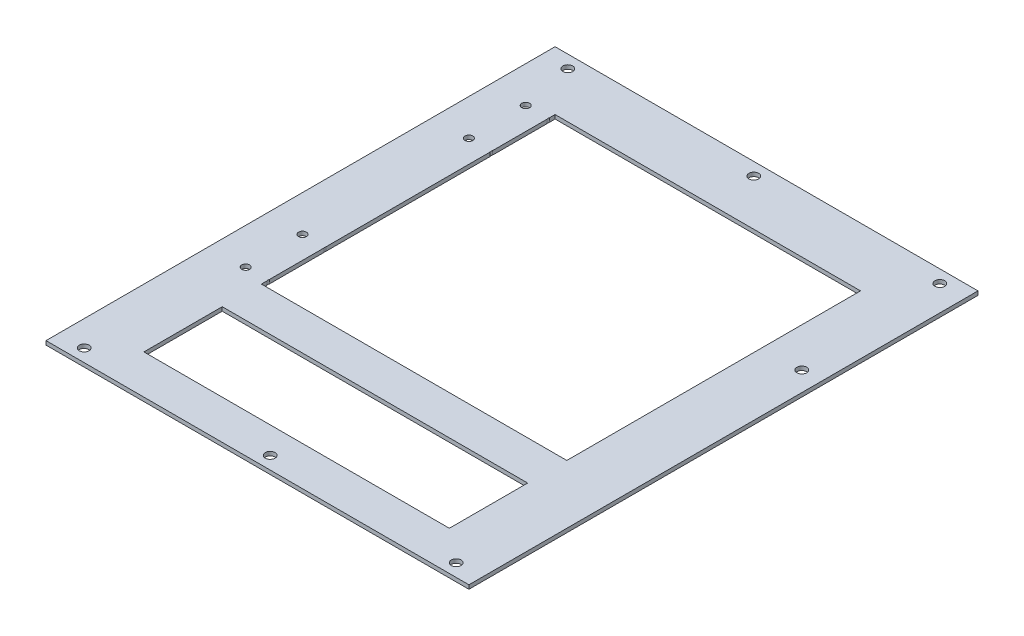
ISO-10303-21;
HEADER;
FILE_DESCRIPTION(('STEP AP214'),'2;1');
FILE_NAME('part.step','',(''),(''),'','','');
FILE_SCHEMA(('AUTOMOTIVE_DESIGN { 1 0 10303 214 1 1 1 1 }'));
ENDSEC;
DATA;
#1=APPLICATION_CONTEXT('core data for automotive mechanical design processes');
#2=APPLICATION_PROTOCOL_DEFINITION('international standard','automotive_design',2000,#1);
#3=PRODUCT_CONTEXT('',#1,'mechanical');
#4=PRODUCT('Part','Part','',(#3));
#5=PRODUCT_RELATED_PRODUCT_CATEGORY('part','',(#4));
#6=PRODUCT_DEFINITION_FORMATION('','',#4);
#7=PRODUCT_DEFINITION_CONTEXT('part definition',#1,'design');
#8=PRODUCT_DEFINITION('design','',#6,#7);
#9=PRODUCT_DEFINITION_SHAPE('','',#8);
#10=(LENGTH_UNIT() NAMED_UNIT(*) SI_UNIT(.MILLI.,.METRE.));
#11=(NAMED_UNIT(*) PLANE_ANGLE_UNIT() SI_UNIT($,.RADIAN.));
#12=(NAMED_UNIT(*) SI_UNIT($,.STERADIAN.) SOLID_ANGLE_UNIT());
#13=UNCERTAINTY_MEASURE_WITH_UNIT(LENGTH_MEASURE(1.E-05),#10,'distance_accuracy_value','');
#14=(GEOMETRIC_REPRESENTATION_CONTEXT(3) GLOBAL_UNCERTAINTY_ASSIGNED_CONTEXT((#13)) GLOBAL_UNIT_ASSIGNED_CONTEXT((#10,
#11,#12)) REPRESENTATION_CONTEXT('',''));
#15=CARTESIAN_POINT('',(0.,0.,0.));
#16=DIRECTION('',(0.,0.,1.));
#17=DIRECTION('',(1.,0.,0.));
#18=AXIS2_PLACEMENT_3D('',#15,#16,#17);
#19=CARTESIAN_POINT('',(-78.,2.,50.));
#20=DIRECTION('',(-1.,0.,0.));
#21=DIRECTION('',(0.,0.,1.));
#22=AXIS2_PLACEMENT_3D('',#19,#20,#21);
#23=PLANE('',#22);
#24=DIRECTION('',(0.,0.,-1.));
#25=VECTOR('',#24,1.);
#26=CARTESIAN_POINT('',(-78.,0.,50.));
#27=LINE('',#26,#25);
#28=CARTESIAN_POINT('',(-78.,0.,50.));
#29=VERTEX_POINT('',#28);
#30=CARTESIAN_POINT('',(-78.,0.,47.124498926168));
#31=VERTEX_POINT('',#30);
#32=EDGE_CURVE('E186',#29,#31,#27,.T.);
#33=ORIENTED_EDGE('',*,*,#32,.T.);
#34=DIRECTION('',(0.,1.,0.));
#35=VECTOR('',#34,1.);
#36=CARTESIAN_POINT('',(-78.,3.80000000000001,47.124498926168));
#37=LINE('',#36,#35);
#38=CARTESIAN_POINT('',(-78.,2.,47.124498926168));
#39=VERTEX_POINT('',#38);
#40=EDGE_CURVE('E51',#31,#39,#37,.T.);
#41=ORIENTED_EDGE('',*,*,#40,.T.);
#42=DIRECTION('',(0.,0.,-1.));
#43=VECTOR('',#42,1.);
#44=CARTESIAN_POINT('',(-78.,2.,50.));
#45=LINE('',#44,#43);
#46=CARTESIAN_POINT('',(-78.,2.,50.));
#47=VERTEX_POINT('',#46);
#48=EDGE_CURVE('E375',#47,#39,#45,.T.);
#49=ORIENTED_EDGE('',*,*,#48,.F.);
#50=DIRECTION('',(0.,-1.,0.));
#51=VECTOR('',#50,1.);
#52=CARTESIAN_POINT('',(-78.,2.,50.));
#53=LINE('',#52,#51);
#54=EDGE_CURVE('E205',#47,#29,#53,.T.);
#55=ORIENTED_EDGE('',*,*,#54,.T.);
#56=EDGE_LOOP('',(#33,#41,#49,#55));
#57=FACE_BOUND('',#56,.T.);
#58=ADVANCED_FACE('F34',(#57),#23,.F.);
#59=CARTESIAN_POINT('',(-78.,2.,45.8755011017217));
#60=VERTEX_POINT('',#59);
#61=CARTESIAN_POINT('',(-78.,2.,18.124498926168));
#62=VERTEX_POINT('',#61);
#63=EDGE_CURVE('E179',#60,#62,#45,.T.);
#64=ORIENTED_EDGE('',*,*,#63,.F.);
#65=DIRECTION('',(0.,1.,0.));
#66=VECTOR('',#65,1.);
#67=CARTESIAN_POINT('',(-78.,3.80000000000001,45.8755011017217));
#68=LINE('',#67,#66);
#69=CARTESIAN_POINT('',(-78.,0.,45.8755011017217));
#70=VERTEX_POINT('',#69);
#71=EDGE_CURVE('E172',#60,#70,#68,.F.);
#72=ORIENTED_EDGE('',*,*,#71,.T.);
#73=CARTESIAN_POINT('',(-78.,0.,18.124498926168));
#74=VERTEX_POINT('',#73);
#75=EDGE_CURVE('E58',#70,#74,#27,.T.);
#76=ORIENTED_EDGE('',*,*,#75,.T.);
#77=DIRECTION('',(0.,1.,0.));
#78=VECTOR('',#77,1.);
#79=CARTESIAN_POINT('',(-78.,3.8,18.124498926168));
#80=LINE('',#79,#78);
#81=EDGE_CURVE('E302',#74,#62,#80,.T.);
#82=ORIENTED_EDGE('',*,*,#81,.T.);
#83=EDGE_LOOP('',(#64,#72,#76,#82));
#84=FACE_BOUND('',#83,.T.);
#85=ADVANCED_FACE('F178',(#84),#23,.F.);
#86=CARTESIAN_POINT('',(-78.,2.,16.8755011017216));
#87=VERTEX_POINT('',#86);
#88=CARTESIAN_POINT('',(-78.,2.,-66.8755002001601));
#89=VERTEX_POINT('',#88);
#90=EDGE_CURVE('E405',#87,#89,#45,.T.);
#91=ORIENTED_EDGE('',*,*,#90,.F.);
#92=DIRECTION('',(0.,1.,0.));
#93=VECTOR('',#92,1.);
#94=CARTESIAN_POINT('',(-78.,3.8,16.8755011017216));
#95=LINE('',#94,#93);
#96=CARTESIAN_POINT('',(-78.,0.,16.8755011017216));
#97=VERTEX_POINT('',#96);
#98=EDGE_CURVE('E299',#87,#97,#95,.F.);
#99=ORIENTED_EDGE('',*,*,#98,.T.);
#100=CARTESIAN_POINT('',(-78.,0.,-66.8755002001601));
#101=VERTEX_POINT('',#100);
#102=EDGE_CURVE('E187',#97,#101,#27,.T.);
#103=ORIENTED_EDGE('',*,*,#102,.T.);
#104=DIRECTION('',(0.,1.,0.));
#105=VECTOR('',#104,1.);
#106=CARTESIAN_POINT('',(-78.,3.79999999999997,-66.8755002001601));
#107=LINE('',#106,#105);
#108=EDGE_CURVE('E315',#101,#89,#107,.T.);
#109=ORIENTED_EDGE('',*,*,#108,.T.);
#110=EDGE_LOOP('',(#91,#99,#103,#109));
#111=FACE_BOUND('',#110,.T.);
#112=ADVANCED_FACE('F414',(#111),#23,.F.);
#113=CARTESIAN_POINT('',(-78.,2.,-68.1244997998396));
#114=VERTEX_POINT('',#113);
#115=CARTESIAN_POINT('',(-78.,2.,-95.87550020016));
#116=VERTEX_POINT('',#115);
#117=EDGE_CURVE('E404',#114,#116,#45,.T.);
#118=ORIENTED_EDGE('',*,*,#117,.F.);
#119=DIRECTION('',(0.,1.,0.));
#120=VECTOR('',#119,1.);
#121=CARTESIAN_POINT('',(-78.,3.79999999999997,-68.1244997998396));
#122=LINE('',#121,#120);
#123=CARTESIAN_POINT('',(-78.,0.,-68.1244997998396));
#124=VERTEX_POINT('',#123);
#125=EDGE_CURVE('E312',#114,#124,#122,.F.);
#126=ORIENTED_EDGE('',*,*,#125,.T.);
#127=CARTESIAN_POINT('',(-78.,0.,-95.87550020016));
#128=VERTEX_POINT('',#127);
#129=EDGE_CURVE('E191',#124,#128,#27,.T.);
#130=ORIENTED_EDGE('',*,*,#129,.T.);
#131=DIRECTION('',(0.,1.,0.));
#132=VECTOR('',#131,1.);
#133=CARTESIAN_POINT('',(-78.,3.79999999999996,-95.87550020016));
#134=LINE('',#133,#132);
#135=EDGE_CURVE('E327',#128,#116,#134,.T.);
#136=ORIENTED_EDGE('',*,*,#135,.T.);
#137=EDGE_LOOP('',(#118,#126,#130,#136));
#138=FACE_BOUND('',#137,.T.);
#139=ADVANCED_FACE('F392',(#138),#23,.F.);
#140=CARTESIAN_POINT('',(-108.,2.,130.));
#141=DIRECTION('',(1.,0.,0.));
#142=DIRECTION('',(0.,0.,-1.));
#143=AXIS2_PLACEMENT_3D('',#140,#141,#142);
#144=PLANE('',#143);
#145=DIRECTION('',(0.,0.,1.));
#146=VECTOR('',#145,1.);
#147=CARTESIAN_POINT('',(-108.,0.,130.));
#148=LINE('',#147,#146);
#149=CARTESIAN_POINT('',(-108.,0.,-130.));
#150=VERTEX_POINT('',#149);
#151=CARTESIAN_POINT('',(-108.,0.,130.));
#152=VERTEX_POINT('',#151);
#153=EDGE_CURVE('E201',#150,#152,#148,.T.);
#154=ORIENTED_EDGE('',*,*,#153,.T.);
#155=DIRECTION('',(0.,-1.,0.));
#156=VECTOR('',#155,1.);
#157=CARTESIAN_POINT('',(-108.,2.,130.));
#158=LINE('',#157,#156);
#159=CARTESIAN_POINT('',(-108.,2.,130.));
#160=VERTEX_POINT('',#159);
#161=EDGE_CURVE('E237',#160,#152,#158,.T.);
#162=ORIENTED_EDGE('',*,*,#161,.F.);
#163=DIRECTION('',(0.,0.,1.));
#164=VECTOR('',#163,1.);
#165=CARTESIAN_POINT('',(-108.,2.,130.));
#166=LINE('',#165,#164);
#167=CARTESIAN_POINT('',(-108.,2.,-130.));
#168=VERTEX_POINT('',#167);
#169=EDGE_CURVE('E211',#168,#160,#166,.T.);
#170=ORIENTED_EDGE('',*,*,#169,.F.);
#171=DIRECTION('',(0.,-1.,0.));
#172=VECTOR('',#171,1.);
#173=CARTESIAN_POINT('',(-108.,2.,-130.));
#174=LINE('',#173,#172);
#175=EDGE_CURVE('E221',#168,#150,#174,.T.);
#176=ORIENTED_EDGE('',*,*,#175,.T.);
#177=EDGE_LOOP('',(#154,#162,#170,#176));
#178=FACE_BOUND('',#177,.T.);
#179=ADVANCED_FACE('F36',(#178),#144,.F.);
#180=CARTESIAN_POINT('',(108.,2.,130.));
#181=DIRECTION('',(0.,0.,-1.));
#182=DIRECTION('',(-1.,0.,0.));
#183=AXIS2_PLACEMENT_3D('',#180,#181,#182);
#184=PLANE('',#183);
#185=DIRECTION('',(1.,0.,0.));
#186=VECTOR('',#185,1.);
#187=CARTESIAN_POINT('',(108.,0.,130.));
#188=LINE('',#187,#186);
#189=CARTESIAN_POINT('',(108.,0.,130.));
#190=VERTEX_POINT('',#189);
#191=EDGE_CURVE('E224',#152,#190,#188,.T.);
#192=ORIENTED_EDGE('',*,*,#191,.T.);
#193=DIRECTION('',(0.,-1.,0.));
#194=VECTOR('',#193,1.);
#195=CARTESIAN_POINT('',(108.,2.,130.));
#196=LINE('',#195,#194);
#197=CARTESIAN_POINT('',(108.,2.,130.));
#198=VERTEX_POINT('',#197);
#199=EDGE_CURVE('E234',#198,#190,#196,.T.);
#200=ORIENTED_EDGE('',*,*,#199,.F.);
#201=DIRECTION('',(1.,0.,0.));
#202=VECTOR('',#201,1.);
#203=CARTESIAN_POINT('',(108.,2.,130.));
#204=LINE('',#203,#202);
#205=EDGE_CURVE('E214',#160,#198,#204,.T.);
#206=ORIENTED_EDGE('',*,*,#205,.F.);
#207=ORIENTED_EDGE('',*,*,#161,.T.);
#208=EDGE_LOOP('',(#192,#200,#206,#207));
#209=FACE_BOUND('',#208,.T.);
#210=ADVANCED_FACE('F453',(#209),#184,.F.);
#211=CARTESIAN_POINT('',(108.,2.,130.));
#212=DIRECTION('',(-1.,0.,0.));
#213=DIRECTION('',(0.,0.,1.));
#214=AXIS2_PLACEMENT_3D('',#211,#212,#213);
#215=PLANE('',#214);
#216=DIRECTION('',(0.,0.,-1.));
#217=VECTOR('',#216,1.);
#218=CARTESIAN_POINT('',(108.,0.,130.));
#219=LINE('',#218,#217);
#220=CARTESIAN_POINT('',(108.,0.,-130.));
#221=VERTEX_POINT('',#220);
#222=EDGE_CURVE('E226',#190,#221,#219,.T.);
#223=ORIENTED_EDGE('',*,*,#222,.T.);
#224=DIRECTION('',(0.,-1.,0.));
#225=VECTOR('',#224,1.);
#226=CARTESIAN_POINT('',(108.,2.,-130.));
#227=LINE('',#226,#225);
#228=CARTESIAN_POINT('',(108.,2.,-130.));
#229=VERTEX_POINT('',#228);
#230=EDGE_CURVE('E231',#229,#221,#227,.T.);
#231=ORIENTED_EDGE('',*,*,#230,.F.);
#232=DIRECTION('',(0.,0.,-1.));
#233=VECTOR('',#232,1.);
#234=CARTESIAN_POINT('',(108.,2.,130.));
#235=LINE('',#234,#233);
#236=EDGE_CURVE('E217',#198,#229,#235,.T.);
#237=ORIENTED_EDGE('',*,*,#236,.F.);
#238=ORIENTED_EDGE('',*,*,#199,.T.);
#239=EDGE_LOOP('',(#223,#231,#237,#238));
#240=FACE_BOUND('',#239,.T.);
#241=ADVANCED_FACE('F657',(#240),#215,.F.);
#242=CARTESIAN_POINT('',(108.,2.,-130.));
#243=DIRECTION('',(0.,0.,1.));
#244=DIRECTION('',(1.,0.,0.));
#245=AXIS2_PLACEMENT_3D('',#242,#243,#244);
#246=PLANE('',#245);
#247=DIRECTION('',(-1.,0.,0.));
#248=VECTOR('',#247,1.);
#249=CARTESIAN_POINT('',(108.,0.,-130.));
#250=LINE('',#249,#248);
#251=EDGE_CURVE('E215',#221,#150,#250,.T.);
#252=ORIENTED_EDGE('',*,*,#251,.T.);
#253=ORIENTED_EDGE('',*,*,#175,.F.);
#254=DIRECTION('',(-1.,0.,0.));
#255=VECTOR('',#254,1.);
#256=CARTESIAN_POINT('',(108.,2.,-130.));
#257=LINE('',#256,#255);
#258=EDGE_CURVE('E219',#229,#168,#257,.T.);
#259=ORIENTED_EDGE('',*,*,#258,.F.);
#260=ORIENTED_EDGE('',*,*,#230,.T.);
#261=EDGE_LOOP('',(#252,#253,#259,#260));
#262=FACE_BOUND('',#261,.T.);
#263=ADVANCED_FACE('F605',(#262),#246,.F.);
#264=CARTESIAN_POINT('',(0.,2.,0.));
#265=DIRECTION('',(0.,1.,0.));
#266=DIRECTION('',(0.,0.,1.));
#267=AXIS2_PLACEMENT_3D('',#264,#265,#266);
#268=PLANE('',#267);
#269=CARTESIAN_POINT('',(94.9999999999996,2.,-123.5));
#270=DIRECTION('',(0.,-1.,0.));
#271=DIRECTION('',(0.,0.,-1.));
#272=AXIS2_PLACEMENT_3D('',#269,#270,#271);
#273=CIRCLE('',#272,2.49999999999989);
#274=CARTESIAN_POINT('',(94.9999999999996,2.,-126.));
#275=VERTEX_POINT('',#274);
#276=EDGE_CURVE('E596',#275,#275,#273,.T.);
#277=ORIENTED_EDGE('',*,*,#276,.T.);
#278=EDGE_LOOP('',(#277));
#279=FACE_BOUND('',#278,.T.);
#280=CARTESIAN_POINT('',(-3.40005801291454E-13,2.,-123.5));
#281=DIRECTION('',(0.,-1.,0.));
#282=DIRECTION('',(0.,0.,-1.));
#283=AXIS2_PLACEMENT_3D('',#280,#281,#282);
#284=CIRCLE('',#283,2.49999999999989);
#285=CARTESIAN_POINT('',(-3.40005801291454E-13,2.,-126.));
#286=VERTEX_POINT('',#285);
#287=EDGE_CURVE('E284',#286,#286,#284,.T.);
#288=ORIENTED_EDGE('',*,*,#287,.T.);
#289=EDGE_LOOP('',(#288));
#290=FACE_BOUND('',#289,.T.);
#291=CARTESIAN_POINT('',(-95.0000000000003,2.,-123.499999999999));
#292=DIRECTION('',(0.,-1.,0.));
#293=DIRECTION('',(0.,0.,-1.));
#294=AXIS2_PLACEMENT_3D('',#291,#292,#293);
#295=CIRCLE('',#294,2.49999999999989);
#296=CARTESIAN_POINT('',(-95.0000000000003,2.,-125.999999999999));
#297=VERTEX_POINT('',#296);
#298=EDGE_CURVE('E274',#297,#297,#295,.T.);
#299=ORIENTED_EDGE('',*,*,#298,.T.);
#300=EDGE_LOOP('',(#299));
#301=FACE_BOUND('',#300,.T.);
#302=CARTESIAN_POINT('',(94.9999999999999,2.,123.5));
#303=DIRECTION('',(0.,-1.,0.));
#304=DIRECTION('',(0.,0.,-1.));
#305=AXIS2_PLACEMENT_3D('',#302,#303,#304);
#306=CIRCLE('',#305,2.49999999999989);
#307=CARTESIAN_POINT('',(94.9999999999999,2.,121.));
#308=VERTEX_POINT('',#307);
#309=EDGE_CURVE('E271',#308,#308,#306,.T.);
#310=ORIENTED_EDGE('',*,*,#309,.T.);
#311=EDGE_LOOP('',(#310));
#312=FACE_BOUND('',#311,.T.);
#313=CARTESIAN_POINT('',(0.,2.,123.5));
#314=DIRECTION('',(0.,-1.,0.));
#315=DIRECTION('',(0.,0.,-1.));
#316=AXIS2_PLACEMENT_3D('',#313,#314,#315);
#317=CIRCLE('',#316,2.49999999999989);
#318=CARTESIAN_POINT('',(0.,2.,121.));
#319=VERTEX_POINT('',#318);
#320=EDGE_CURVE('E268',#319,#319,#317,.T.);
#321=ORIENTED_EDGE('',*,*,#320,.T.);
#322=EDGE_LOOP('',(#321));
#323=FACE_BOUND('',#322,.T.);
#324=CARTESIAN_POINT('',(-95.0000000000001,2.,123.500000000001));
#325=DIRECTION('',(0.,-1.,0.));
#326=DIRECTION('',(0.,0.,-1.));
#327=AXIS2_PLACEMENT_3D('',#324,#325,#326);
#328=CIRCLE('',#327,2.49999999999989);
#329=CARTESIAN_POINT('',(-95.0000000000001,2.,121.000000000001));
#330=VERTEX_POINT('',#329);
#331=EDGE_CURVE('E267',#330,#330,#328,.T.);
#332=ORIENTED_EDGE('',*,*,#331,.T.);
#333=EDGE_LOOP('',(#332));
#334=FACE_BOUND('',#333,.T.);
#335=CARTESIAN_POINT('',(-89.5000000000001,2.,46.5000000000001));
#336=DIRECTION('',(0.,1.,0.));
#337=DIRECTION('',(0.,0.,1.));
#338=AXIS2_PLACEMENT_3D('',#335,#336,#337);
#339=CIRCLE('',#338,2.);
#340=CARTESIAN_POINT('',(-89.5000000000001,2.,48.5000000000001));
#341=VERTEX_POINT('',#340);
#342=EDGE_CURVE('E180',#341,#341,#339,.T.);
#343=ORIENTED_EDGE('',*,*,#342,.F.);
#344=EDGE_LOOP('',(#343));
#345=FACE_BOUND('',#344,.T.);
#346=CARTESIAN_POINT('',(-76.0999997082548,2.,46.5000000139448));
#347=DIRECTION('',(0.,1.,0.));
#348=DIRECTION('',(0.,0.,1.));
#349=AXIS2_PLACEMENT_3D('',#346,#347,#348);
#350=CIRCLE('',#349,2.);
#351=EDGE_CURVE('E297',#60,#39,#350,.T.);
#352=ORIENTED_EDGE('',*,*,#351,.F.);
#353=ORIENTED_EDGE('',*,*,#63,.T.);
#354=CARTESIAN_POINT('',(-76.0999997082548,2.,17.5000000139448));
#355=DIRECTION('',(0.,1.,0.));
#356=DIRECTION('',(0.,0.,1.));
#357=AXIS2_PLACEMENT_3D('',#354,#355,#356);
#358=CIRCLE('',#357,2.);
#359=EDGE_CURVE('E258',#87,#62,#358,.T.);
#360=ORIENTED_EDGE('',*,*,#359,.F.);
#361=ORIENTED_EDGE('',*,*,#90,.T.);
#362=CARTESIAN_POINT('',(-76.1,2.,-67.4999999999998));
#363=DIRECTION('',(0.,1.,0.));
#364=DIRECTION('',(0.,0.,1.));
#365=AXIS2_PLACEMENT_3D('',#362,#363,#364);
#366=CIRCLE('',#365,2.);
#367=EDGE_CURVE('E318',#114,#89,#366,.T.);
#368=ORIENTED_EDGE('',*,*,#367,.F.);
#369=ORIENTED_EDGE('',*,*,#117,.T.);
#370=CARTESIAN_POINT('',(-76.1,2.,-96.4999999999999));
#371=DIRECTION('',(0.,1.,0.));
#372=DIRECTION('',(0.,0.,1.));
#373=AXIS2_PLACEMENT_3D('',#370,#371,#372);
#374=CIRCLE('',#373,2.);
#375=CARTESIAN_POINT('',(-78.,2.,-97.1244997998397));
#376=VERTEX_POINT('',#375);
#377=EDGE_CURVE('E240',#376,#116,#374,.T.);
#378=ORIENTED_EDGE('',*,*,#377,.F.);
#379=CARTESIAN_POINT('',(-78.,2.,-100.));
#380=VERTEX_POINT('',#379);
#381=EDGE_CURVE('E374',#376,#380,#45,.T.);
#382=ORIENTED_EDGE('',*,*,#381,.T.);
#383=DIRECTION('',(1.,0.,0.));
#384=VECTOR('',#383,1.);
#385=CARTESIAN_POINT('',(-78.,2.,-100.));
#386=LINE('',#385,#384);
#387=CARTESIAN_POINT('',(78.,2.,-100.));
#388=VERTEX_POINT('',#387);
#389=EDGE_CURVE('E210',#380,#388,#386,.T.);
#390=ORIENTED_EDGE('',*,*,#389,.T.);
#391=DIRECTION('',(0.,0.,1.));
#392=VECTOR('',#391,1.);
#393=CARTESIAN_POINT('',(78.,2.,50.));
#394=LINE('',#393,#392);
#395=CARTESIAN_POINT('',(78.,2.,50.));
#396=VERTEX_POINT('',#395);
#397=EDGE_CURVE('E198',#388,#396,#394,.T.);
#398=ORIENTED_EDGE('',*,*,#397,.T.);
#399=DIRECTION('',(-1.,0.,0.));
#400=VECTOR('',#399,1.);
#401=CARTESIAN_POINT('',(-78.,2.,50.));
#402=LINE('',#401,#400);
#403=EDGE_CURVE('E371',#396,#47,#402,.T.);
#404=ORIENTED_EDGE('',*,*,#403,.T.);
#405=ORIENTED_EDGE('',*,*,#48,.T.);
#406=EDGE_LOOP('',(#352,#353,#360,#361,#368,#369,#378,#382,#390,#398,#404,#405));
#407=FACE_BOUND('',#406,.T.);
#408=CARTESIAN_POINT('',(-89.5000000000001,2.,17.5000000000001));
#409=DIRECTION('',(0.,1.,0.));
#410=DIRECTION('',(0.,0.,1.));
#411=AXIS2_PLACEMENT_3D('',#408,#409,#410);
#412=CIRCLE('',#411,2.);
#413=CARTESIAN_POINT('',(-89.5000000000001,2.,19.5000000000001));
#414=VERTEX_POINT('',#413);
#415=EDGE_CURVE('E254',#414,#414,#412,.T.);
#416=ORIENTED_EDGE('',*,*,#415,.F.);
#417=EDGE_LOOP('',(#416));
#418=FACE_BOUND('',#417,.T.);
#419=CARTESIAN_POINT('',(-89.4999999999992,2.,-96.4999999999995));
#420=DIRECTION('',(0.,1.,0.));
#421=DIRECTION('',(0.,0.,1.));
#422=AXIS2_PLACEMENT_3D('',#419,#420,#421);
#423=CIRCLE('',#422,2.);
#424=CARTESIAN_POINT('',(-89.4999999999992,2.,-94.4999999999995));
#425=VERTEX_POINT('',#424);
#426=EDGE_CURVE('E250',#425,#425,#423,.T.);
#427=ORIENTED_EDGE('',*,*,#426,.F.);
#428=EDGE_LOOP('',(#427));
#429=FACE_BOUND('',#428,.T.);
#430=CARTESIAN_POINT('',(-89.4999999999992,2.,-67.4999999999996));
#431=DIRECTION('',(0.,1.,0.));
#432=DIRECTION('',(0.,0.,1.));
#433=AXIS2_PLACEMENT_3D('',#430,#431,#432);
#434=CIRCLE('',#433,2.);
#435=CARTESIAN_POINT('',(-89.4999999999992,2.,-65.4999999999996));
#436=VERTEX_POINT('',#435);
#437=EDGE_CURVE('E249',#436,#436,#434,.T.);
#438=ORIENTED_EDGE('',*,*,#437,.F.);
#439=EDGE_LOOP('',(#438));
#440=FACE_BOUND('',#439,.T.);
#441=CARTESIAN_POINT('',(98.,2.,-50.));
#442=DIRECTION('',(0.,-1.,0.));
#443=DIRECTION('',(0.,0.,-1.));
#444=AXIS2_PLACEMENT_3D('',#441,#442,#443);
#445=CIRCLE('',#444,2.5);
#446=CARTESIAN_POINT('',(98.,2.,-52.5));
#447=VERTEX_POINT('',#446);
#448=EDGE_CURVE('E331',#447,#447,#445,.T.);
#449=ORIENTED_EDGE('',*,*,#448,.T.);
#450=EDGE_LOOP('',(#449));
#451=FACE_BOUND('',#450,.T.);
#452=DIRECTION('',(0.,0.,1.));
#453=VECTOR('',#452,1.);
#454=CARTESIAN_POINT('',(78.,2.,110.));
#455=LINE('',#454,#453);
#456=CARTESIAN_POINT('',(78.,2.,70.));
#457=VERTEX_POINT('',#456);
#458=CARTESIAN_POINT('',(78.,2.,110.));
#459=VERTEX_POINT('',#458);
#460=EDGE_CURVE('E337',#457,#459,#455,.T.);
#461=ORIENTED_EDGE('',*,*,#460,.T.);
#462=DIRECTION('',(-1.,0.,0.));
#463=VECTOR('',#462,1.);
#464=CARTESIAN_POINT('',(-78.,2.,110.));
#465=LINE('',#464,#463);
#466=CARTESIAN_POINT('',(-78.,2.,110.));
#467=VERTEX_POINT('',#466);
#468=EDGE_CURVE('E340',#459,#467,#465,.T.);
#469=ORIENTED_EDGE('',*,*,#468,.T.);
#470=DIRECTION('',(0.,0.,-1.));
#471=VECTOR('',#470,1.);
#472=CARTESIAN_POINT('',(-78.,2.,110.));
#473=LINE('',#472,#471);
#474=CARTESIAN_POINT('',(-78.,2.,70.));
#475=VERTEX_POINT('',#474);
#476=EDGE_CURVE('E344',#467,#475,#473,.T.);
#477=ORIENTED_EDGE('',*,*,#476,.T.);
#478=DIRECTION('',(1.,0.,0.));
#479=VECTOR('',#478,1.);
#480=CARTESIAN_POINT('',(-78.,2.,70.));
#481=LINE('',#480,#479);
#482=EDGE_CURVE('E347',#475,#457,#481,.T.);
#483=ORIENTED_EDGE('',*,*,#482,.T.);
#484=EDGE_LOOP('',(#461,#469,#477,#483));
#485=FACE_BOUND('',#484,.T.);
#486=ORIENTED_EDGE('',*,*,#169,.T.);
#487=ORIENTED_EDGE('',*,*,#205,.T.);
#488=ORIENTED_EDGE('',*,*,#236,.T.);
#489=ORIENTED_EDGE('',*,*,#258,.T.);
#490=EDGE_LOOP('',(#486,#487,#488,#489));
#491=FACE_BOUND('',#490,.T.);
#492=ADVANCED_FACE('F409',(#279,#290,#301,#312,#323,#334,#345,#407,#418,#429,#440,#451,#485,
#491),#268,.T.);
#493=CARTESIAN_POINT('',(0.,0.,0.));
#494=DIRECTION('',(0.,1.,0.));
#495=DIRECTION('',(0.,0.,1.));
#496=AXIS2_PLACEMENT_3D('',#493,#494,#495);
#497=PLANE('',#496);
#498=CARTESIAN_POINT('',(94.9999999999996,0.,-123.5));
#499=DIRECTION('',(0.,1.,0.));
#500=DIRECTION('',(0.,0.,1.));
#501=AXIS2_PLACEMENT_3D('',#498,#499,#500);
#502=CIRCLE('',#501,2.49999999999992);
#503=CARTESIAN_POINT('',(94.9999999999996,0.,-121.));
#504=VERTEX_POINT('',#503);
#505=EDGE_CURVE('E599',#504,#504,#502,.T.);
#506=ORIENTED_EDGE('',*,*,#505,.T.);
#507=EDGE_LOOP('',(#506));
#508=FACE_BOUND('',#507,.T.);
#509=CARTESIAN_POINT('',(-3.40005801291454E-13,0.,-123.5));
#510=DIRECTION('',(0.,1.,0.));
#511=DIRECTION('',(0.,0.,1.));
#512=AXIS2_PLACEMENT_3D('',#509,#510,#511);
#513=CIRCLE('',#512,2.49999999999992);
#514=CARTESIAN_POINT('',(-3.40005801291454E-13,0.,-121.));
#515=VERTEX_POINT('',#514);
#516=EDGE_CURVE('E38',#515,#515,#513,.T.);
#517=ORIENTED_EDGE('',*,*,#516,.T.);
#518=EDGE_LOOP('',(#517));
#519=FACE_BOUND('',#518,.T.);
#520=CARTESIAN_POINT('',(-95.0000000000003,0.,-123.499999999999));
#521=DIRECTION('',(0.,1.,0.));
#522=DIRECTION('',(0.,0.,1.));
#523=AXIS2_PLACEMENT_3D('',#520,#521,#522);
#524=CIRCLE('',#523,2.49999999999992);
#525=CARTESIAN_POINT('',(-95.0000000000003,0.,-121.));
#526=VERTEX_POINT('',#525);
#527=EDGE_CURVE('E272',#526,#526,#524,.T.);
#528=ORIENTED_EDGE('',*,*,#527,.T.);
#529=EDGE_LOOP('',(#528));
#530=FACE_BOUND('',#529,.T.);
#531=CARTESIAN_POINT('',(94.9999999999999,0.,123.5));
#532=DIRECTION('',(0.,1.,0.));
#533=DIRECTION('',(0.,0.,1.));
#534=AXIS2_PLACEMENT_3D('',#531,#532,#533);
#535=CIRCLE('',#534,2.49999999999992);
#536=CARTESIAN_POINT('',(94.9999999999999,0.,126.));
#537=VERTEX_POINT('',#536);
#538=EDGE_CURVE('E269',#537,#537,#535,.T.);
#539=ORIENTED_EDGE('',*,*,#538,.T.);
#540=EDGE_LOOP('',(#539));
#541=FACE_BOUND('',#540,.T.);
#542=CARTESIAN_POINT('',(0.,0.,123.5));
#543=DIRECTION('',(0.,1.,0.));
#544=DIRECTION('',(0.,0.,1.));
#545=AXIS2_PLACEMENT_3D('',#542,#543,#544);
#546=CIRCLE('',#545,2.49999999999992);
#547=CARTESIAN_POINT('',(0.,0.,126.));
#548=VERTEX_POINT('',#547);
#549=EDGE_CURVE('E264',#548,#548,#546,.T.);
#550=ORIENTED_EDGE('',*,*,#549,.T.);
#551=EDGE_LOOP('',(#550));
#552=FACE_BOUND('',#551,.T.);
#553=CARTESIAN_POINT('',(-95.0000000000001,0.,123.500000000001));
#554=DIRECTION('',(0.,1.,0.));
#555=DIRECTION('',(0.,0.,1.));
#556=AXIS2_PLACEMENT_3D('',#553,#554,#555);
#557=CIRCLE('',#556,2.49999999999992);
#558=CARTESIAN_POINT('',(-95.0000000000001,0.,126.));
#559=VERTEX_POINT('',#558);
#560=EDGE_CURVE('E263',#559,#559,#557,.T.);
#561=ORIENTED_EDGE('',*,*,#560,.T.);
#562=EDGE_LOOP('',(#561));
#563=FACE_BOUND('',#562,.T.);
#564=CARTESIAN_POINT('',(-89.5000000000001,0.,46.5000000000001));
#565=DIRECTION('',(0.,1.,0.));
#566=DIRECTION('',(0.,0.,1.));
#567=AXIS2_PLACEMENT_3D('',#564,#565,#566);
#568=CIRCLE('',#567,2.);
#569=CARTESIAN_POINT('',(-89.5000000000001,0.,48.5000000000001));
#570=VERTEX_POINT('',#569);
#571=EDGE_CURVE('E260',#570,#570,#568,.T.);
#572=ORIENTED_EDGE('',*,*,#571,.T.);
#573=EDGE_LOOP('',(#572));
#574=FACE_BOUND('',#573,.T.);
#575=CARTESIAN_POINT('',(-89.5000000000001,0.,17.5000000000001));
#576=DIRECTION('',(0.,1.,0.));
#577=DIRECTION('',(0.,0.,1.));
#578=AXIS2_PLACEMENT_3D('',#575,#576,#577);
#579=CIRCLE('',#578,2.);
#580=CARTESIAN_POINT('',(-89.5000000000001,0.,19.5000000000001));
#581=VERTEX_POINT('',#580);
#582=EDGE_CURVE('E255',#581,#581,#579,.T.);
#583=ORIENTED_EDGE('',*,*,#582,.T.);
#584=EDGE_LOOP('',(#583));
#585=FACE_BOUND('',#584,.T.);
#586=CARTESIAN_POINT('',(-89.4999999999992,0.,-96.4999999999995));
#587=DIRECTION('',(0.,1.,0.));
#588=DIRECTION('',(0.,0.,1.));
#589=AXIS2_PLACEMENT_3D('',#586,#587,#588);
#590=CIRCLE('',#589,2.);
#591=CARTESIAN_POINT('',(-89.4999999999992,0.,-94.4999999999995));
#592=VERTEX_POINT('',#591);
#593=EDGE_CURVE('E251',#592,#592,#590,.T.);
#594=ORIENTED_EDGE('',*,*,#593,.T.);
#595=EDGE_LOOP('',(#594));
#596=FACE_BOUND('',#595,.T.);
#597=CARTESIAN_POINT('',(-89.4999999999992,0.,-67.4999999999996));
#598=DIRECTION('',(0.,1.,0.));
#599=DIRECTION('',(0.,0.,1.));
#600=AXIS2_PLACEMENT_3D('',#597,#598,#599);
#601=CIRCLE('',#600,2.);
#602=CARTESIAN_POINT('',(-89.4999999999992,0.,-65.4999999999996));
#603=VERTEX_POINT('',#602);
#604=EDGE_CURVE('E246',#603,#603,#601,.T.);
#605=ORIENTED_EDGE('',*,*,#604,.T.);
#606=EDGE_LOOP('',(#605));
#607=FACE_BOUND('',#606,.T.);
#608=CARTESIAN_POINT('',(98.,0.,-50.));
#609=DIRECTION('',(0.,-1.,0.));
#610=DIRECTION('',(0.,0.,-1.));
#611=AXIS2_PLACEMENT_3D('',#608,#609,#610);
#612=CIRCLE('',#611,2.5);
#613=CARTESIAN_POINT('',(98.,0.,-52.5));
#614=VERTEX_POINT('',#613);
#615=EDGE_CURVE('E330',#614,#614,#612,.T.);
#616=ORIENTED_EDGE('',*,*,#615,.F.);
#617=EDGE_LOOP('',(#616));
#618=FACE_BOUND('',#617,.T.);
#619=DIRECTION('',(-1.,0.,0.));
#620=VECTOR('',#619,1.);
#621=CARTESIAN_POINT('',(-78.,0.,110.));
#622=LINE('',#621,#620);
#623=CARTESIAN_POINT('',(78.,0.,110.));
#624=VERTEX_POINT('',#623);
#625=CARTESIAN_POINT('',(-78.,0.,110.));
#626=VERTEX_POINT('',#625);
#627=EDGE_CURVE('E352',#624,#626,#622,.T.);
#628=ORIENTED_EDGE('',*,*,#627,.F.);
#629=DIRECTION('',(0.,0.,1.));
#630=VECTOR('',#629,1.);
#631=CARTESIAN_POINT('',(78.,0.,110.));
#632=LINE('',#631,#630);
#633=CARTESIAN_POINT('',(78.,0.,70.));
#634=VERTEX_POINT('',#633);
#635=EDGE_CURVE('E334',#634,#624,#632,.T.);
#636=ORIENTED_EDGE('',*,*,#635,.F.);
#637=DIRECTION('',(1.,0.,0.));
#638=VECTOR('',#637,1.);
#639=CARTESIAN_POINT('',(-78.,0.,70.));
#640=LINE('',#639,#638);
#641=CARTESIAN_POINT('',(-78.,0.,70.));
#642=VERTEX_POINT('',#641);
#643=EDGE_CURVE('E341',#642,#634,#640,.T.);
#644=ORIENTED_EDGE('',*,*,#643,.F.);
#645=DIRECTION('',(0.,0.,-1.));
#646=VECTOR('',#645,1.);
#647=CARTESIAN_POINT('',(-78.,0.,110.));
#648=LINE('',#647,#646);
#649=EDGE_CURVE('E355',#626,#642,#648,.T.);
#650=ORIENTED_EDGE('',*,*,#649,.F.);
#651=EDGE_LOOP('',(#628,#636,#644,#650));
#652=FACE_BOUND('',#651,.T.);
#653=ORIENTED_EDGE('',*,*,#75,.F.);
#654=CARTESIAN_POINT('',(-76.0999997082548,0.,46.5000000139448));
#655=DIRECTION('',(0.,1.,0.));
#656=DIRECTION('',(0.,0.,1.));
#657=AXIS2_PLACEMENT_3D('',#654,#655,#656);
#658=CIRCLE('',#657,2.);
#659=EDGE_CURVE('E11',#70,#31,#658,.T.);
#660=ORIENTED_EDGE('',*,*,#659,.T.);
#661=ORIENTED_EDGE('',*,*,#32,.F.);
#662=DIRECTION('',(-1.,0.,0.));
#663=VECTOR('',#662,1.);
#664=CARTESIAN_POINT('',(-78.,0.,50.));
#665=LINE('',#664,#663);
#666=CARTESIAN_POINT('',(78.,0.,50.));
#667=VERTEX_POINT('',#666);
#668=EDGE_CURVE('E194',#667,#29,#665,.T.);
#669=ORIENTED_EDGE('',*,*,#668,.F.);
#670=DIRECTION('',(0.,0.,1.));
#671=VECTOR('',#670,1.);
#672=CARTESIAN_POINT('',(78.,0.,50.));
#673=LINE('',#672,#671);
#674=CARTESIAN_POINT('',(78.,0.,-100.));
#675=VERTEX_POINT('',#674);
#676=EDGE_CURVE('E362',#675,#667,#673,.T.);
#677=ORIENTED_EDGE('',*,*,#676,.F.);
#678=DIRECTION('',(1.,0.,0.));
#679=VECTOR('',#678,1.);
#680=CARTESIAN_POINT('',(-78.,0.,-100.));
#681=LINE('',#680,#679);
#682=CARTESIAN_POINT('',(-78.,0.,-100.));
#683=VERTEX_POINT('',#682);
#684=EDGE_CURVE('E189',#683,#675,#681,.T.);
#685=ORIENTED_EDGE('',*,*,#684,.F.);
#686=CARTESIAN_POINT('',(-78.,0.,-97.1244997998397));
#687=VERTEX_POINT('',#686);
#688=EDGE_CURVE('E190',#687,#683,#27,.T.);
#689=ORIENTED_EDGE('',*,*,#688,.F.);
#690=CARTESIAN_POINT('',(-76.1,0.,-96.4999999999999));
#691=DIRECTION('',(0.,1.,0.));
#692=DIRECTION('',(0.,0.,1.));
#693=AXIS2_PLACEMENT_3D('',#690,#691,#692);
#694=CIRCLE('',#693,2.);
#695=EDGE_CURVE('E324',#687,#128,#694,.T.);
#696=ORIENTED_EDGE('',*,*,#695,.T.);
#697=ORIENTED_EDGE('',*,*,#129,.F.);
#698=CARTESIAN_POINT('',(-76.1,0.,-67.4999999999998));
#699=DIRECTION('',(0.,1.,0.));
#700=DIRECTION('',(0.,0.,1.));
#701=AXIS2_PLACEMENT_3D('',#698,#699,#700);
#702=CIRCLE('',#701,2.);
#703=EDGE_CURVE('E243',#124,#101,#702,.T.);
#704=ORIENTED_EDGE('',*,*,#703,.T.);
#705=ORIENTED_EDGE('',*,*,#102,.F.);
#706=CARTESIAN_POINT('',(-76.0999997082548,0.,17.5000000139448));
#707=DIRECTION('',(0.,1.,0.));
#708=DIRECTION('',(0.,0.,1.));
#709=AXIS2_PLACEMENT_3D('',#706,#707,#708);
#710=CIRCLE('',#709,2.);
#711=EDGE_CURVE('E43',#97,#74,#710,.T.);
#712=ORIENTED_EDGE('',*,*,#711,.T.);
#713=EDGE_LOOP('',(#653,#660,#661,#669,#677,#685,#689,#696,#697,#704,#705,#712));
#714=FACE_BOUND('',#713,.T.);
#715=ORIENTED_EDGE('',*,*,#153,.F.);
#716=ORIENTED_EDGE('',*,*,#251,.F.);
#717=ORIENTED_EDGE('',*,*,#222,.F.);
#718=ORIENTED_EDGE('',*,*,#191,.F.);
#719=EDGE_LOOP('',(#715,#716,#717,#718));
#720=FACE_BOUND('',#719,.T.);
#721=ADVANCED_FACE('F183',(#508,#519,#530,#541,#552,#563,#574,#585,#596,#607,#618,#652,#714,
#720),#497,.F.);
#722=CARTESIAN_POINT('',(78.,2.,50.));
#723=DIRECTION('',(1.,0.,0.));
#724=DIRECTION('',(0.,0.,-1.));
#725=AXIS2_PLACEMENT_3D('',#722,#723,#724);
#726=PLANE('',#725);
#727=ORIENTED_EDGE('',*,*,#676,.T.);
#728=DIRECTION('',(0.,-1.,0.));
#729=VECTOR('',#728,1.);
#730=CARTESIAN_POINT('',(78.,2.,50.));
#731=LINE('',#730,#729);
#732=EDGE_CURVE('E207',#396,#667,#731,.T.);
#733=ORIENTED_EDGE('',*,*,#732,.F.);
#734=ORIENTED_EDGE('',*,*,#397,.F.);
#735=DIRECTION('',(0.,-1.,0.));
#736=VECTOR('',#735,1.);
#737=CARTESIAN_POINT('',(78.,2.,-100.));
#738=LINE('',#737,#736);
#739=EDGE_CURVE('E199',#388,#675,#738,.T.);
#740=ORIENTED_EDGE('',*,*,#739,.T.);
#741=EDGE_LOOP('',(#727,#733,#734,#740));
#742=FACE_BOUND('',#741,.T.);
#743=ADVANCED_FACE('F448',(#742),#726,.F.);
#744=CARTESIAN_POINT('',(-78.,2.,-100.));
#745=DIRECTION('',(0.,0.,-1.));
#746=DIRECTION('',(-1.,0.,0.));
#747=AXIS2_PLACEMENT_3D('',#744,#745,#746);
#748=PLANE('',#747);
#749=ORIENTED_EDGE('',*,*,#684,.T.);
#750=ORIENTED_EDGE('',*,*,#739,.F.);
#751=ORIENTED_EDGE('',*,*,#389,.F.);
#752=DIRECTION('',(0.,-1.,0.));
#753=VECTOR('',#752,1.);
#754=CARTESIAN_POINT('',(-78.,2.,-100.));
#755=LINE('',#754,#753);
#756=EDGE_CURVE('E202',#380,#683,#755,.T.);
#757=ORIENTED_EDGE('',*,*,#756,.T.);
#758=EDGE_LOOP('',(#749,#750,#751,#757));
#759=FACE_BOUND('',#758,.T.);
#760=ADVANCED_FACE('F398',(#759),#748,.F.);
#761=ORIENTED_EDGE('',*,*,#381,.F.);
#762=DIRECTION('',(0.,1.,0.));
#763=VECTOR('',#762,1.);
#764=CARTESIAN_POINT('',(-78.,3.79999999999996,-97.1244997998397));
#765=LINE('',#764,#763);
#766=EDGE_CURVE('E321',#376,#687,#765,.F.);
#767=ORIENTED_EDGE('',*,*,#766,.T.);
#768=ORIENTED_EDGE('',*,*,#688,.T.);
#769=ORIENTED_EDGE('',*,*,#756,.F.);
#770=EDGE_LOOP('',(#761,#767,#768,#769));
#771=FACE_BOUND('',#770,.T.);
#772=ADVANCED_FACE('F402',(#771),#23,.F.);
#773=CARTESIAN_POINT('',(-78.,2.,50.));
#774=DIRECTION('',(0.,0.,1.));
#775=DIRECTION('',(1.,0.,0.));
#776=AXIS2_PLACEMENT_3D('',#773,#774,#775);
#777=PLANE('',#776);
#778=ORIENTED_EDGE('',*,*,#668,.T.);
#779=ORIENTED_EDGE('',*,*,#54,.F.);
#780=ORIENTED_EDGE('',*,*,#403,.F.);
#781=ORIENTED_EDGE('',*,*,#732,.T.);
#782=EDGE_LOOP('',(#778,#779,#780,#781));
#783=FACE_BOUND('',#782,.T.);
#784=ADVANCED_FACE('F440',(#783),#777,.F.);
#785=CARTESIAN_POINT('',(78.,2.,110.));
#786=DIRECTION('',(1.,0.,0.));
#787=DIRECTION('',(0.,0.,-1.));
#788=AXIS2_PLACEMENT_3D('',#785,#786,#787);
#789=PLANE('',#788);
#790=ORIENTED_EDGE('',*,*,#635,.T.);
#791=DIRECTION('',(0.,-1.,0.));
#792=VECTOR('',#791,1.);
#793=CARTESIAN_POINT('',(78.,2.,110.));
#794=LINE('',#793,#792);
#795=EDGE_CURVE('E350',#459,#624,#794,.T.);
#796=ORIENTED_EDGE('',*,*,#795,.F.);
#797=ORIENTED_EDGE('',*,*,#460,.F.);
#798=DIRECTION('',(0.,-1.,0.));
#799=VECTOR('',#798,1.);
#800=CARTESIAN_POINT('',(78.,2.,70.));
#801=LINE('',#800,#799);
#802=EDGE_CURVE('E360',#457,#634,#801,.T.);
#803=ORIENTED_EDGE('',*,*,#802,.T.);
#804=EDGE_LOOP('',(#790,#796,#797,#803));
#805=FACE_BOUND('',#804,.T.);
#806=ADVANCED_FACE('F446',(#805),#789,.F.);
#807=CARTESIAN_POINT('',(-78.,2.,70.));
#808=DIRECTION('',(0.,0.,-1.));
#809=DIRECTION('',(-1.,0.,0.));
#810=AXIS2_PLACEMENT_3D('',#807,#808,#809);
#811=PLANE('',#810);
#812=ORIENTED_EDGE('',*,*,#643,.T.);
#813=ORIENTED_EDGE('',*,*,#802,.F.);
#814=ORIENTED_EDGE('',*,*,#482,.F.);
#815=DIRECTION('',(0.,-1.,0.));
#816=VECTOR('',#815,1.);
#817=CARTESIAN_POINT('',(-78.,2.,70.));
#818=LINE('',#817,#816);
#819=EDGE_CURVE('E363',#475,#642,#818,.T.);
#820=ORIENTED_EDGE('',*,*,#819,.T.);
#821=EDGE_LOOP('',(#812,#813,#814,#820));
#822=FACE_BOUND('',#821,.T.);
#823=ADVANCED_FACE('F641',(#822),#811,.F.);
#824=CARTESIAN_POINT('',(-78.,2.,110.));
#825=DIRECTION('',(-1.,0.,0.));
#826=DIRECTION('',(0.,0.,1.));
#827=AXIS2_PLACEMENT_3D('',#824,#825,#826);
#828=PLANE('',#827);
#829=ORIENTED_EDGE('',*,*,#649,.T.);
#830=ORIENTED_EDGE('',*,*,#819,.F.);
#831=ORIENTED_EDGE('',*,*,#476,.F.);
#832=DIRECTION('',(0.,-1.,0.));
#833=VECTOR('',#832,1.);
#834=CARTESIAN_POINT('',(-78.,2.,110.));
#835=LINE('',#834,#833);
#836=EDGE_CURVE('E365',#467,#626,#835,.T.);
#837=ORIENTED_EDGE('',*,*,#836,.T.);
#838=EDGE_LOOP('',(#829,#830,#831,#837));
#839=FACE_BOUND('',#838,.T.);
#840=ADVANCED_FACE('F643',(#839),#828,.F.);
#841=CARTESIAN_POINT('',(-78.,2.,110.));
#842=DIRECTION('',(0.,0.,1.));
#843=DIRECTION('',(1.,0.,0.));
#844=AXIS2_PLACEMENT_3D('',#841,#842,#843);
#845=PLANE('',#844);
#846=ORIENTED_EDGE('',*,*,#627,.T.);
#847=ORIENTED_EDGE('',*,*,#836,.F.);
#848=ORIENTED_EDGE('',*,*,#468,.F.);
#849=ORIENTED_EDGE('',*,*,#795,.T.);
#850=EDGE_LOOP('',(#846,#847,#848,#849));
#851=FACE_BOUND('',#850,.T.);
#852=ADVANCED_FACE('F635',(#851),#845,.F.);
#853=CARTESIAN_POINT('',(98.,2.,-50.));
#854=DIRECTION('',(0.,-1.,0.));
#855=DIRECTION('',(0.,0.,-1.));
#856=AXIS2_PLACEMENT_3D('',#853,#854,#855);
#857=CYLINDRICAL_SURFACE('',#856,2.5);
#858=ORIENTED_EDGE('',*,*,#448,.F.);
#859=EDGE_LOOP('',(#858));
#860=FACE_BOUND('',#859,.T.);
#861=ORIENTED_EDGE('',*,*,#615,.T.);
#862=EDGE_LOOP('',(#861));
#863=FACE_BOUND('',#862,.T.);
#864=ADVANCED_FACE('F428',(#860,#863),#857,.F.);
#865=CARTESIAN_POINT('',(-76.1,3.79999999999996,-96.4999999999999));
#866=DIRECTION('',(0.,1.,0.));
#867=DIRECTION('',(0.,0.,1.));
#868=AXIS2_PLACEMENT_3D('',#865,#866,#867);
#869=CYLINDRICAL_SURFACE('',#868,2.);
#870=ORIENTED_EDGE('',*,*,#695,.F.);
#871=ORIENTED_EDGE('',*,*,#766,.F.);
#872=ORIENTED_EDGE('',*,*,#377,.T.);
#873=ORIENTED_EDGE('',*,*,#135,.F.);
#874=EDGE_LOOP('',(#870,#871,#872,#873));
#875=FACE_BOUND('',#874,.T.);
#876=ADVANCED_FACE('F394',(#875),#869,.F.);
#877=CARTESIAN_POINT('',(-76.1,3.79999999999997,-67.4999999999998));
#878=DIRECTION('',(0.,1.,0.));
#879=DIRECTION('',(0.,0.,1.));
#880=AXIS2_PLACEMENT_3D('',#877,#878,#879);
#881=CYLINDRICAL_SURFACE('',#880,2.);
#882=ORIENTED_EDGE('',*,*,#367,.T.);
#883=ORIENTED_EDGE('',*,*,#108,.F.);
#884=ORIENTED_EDGE('',*,*,#703,.F.);
#885=ORIENTED_EDGE('',*,*,#125,.F.);
#886=EDGE_LOOP('',(#882,#883,#884,#885));
#887=FACE_BOUND('',#886,.T.);
#888=ADVANCED_FACE('F417',(#887),#881,.F.);
#889=CARTESIAN_POINT('',(-89.4999999999992,3.79999999999999,-67.4999999999996));
#890=DIRECTION('',(0.,1.,0.));
#891=DIRECTION('',(0.,0.,1.));
#892=AXIS2_PLACEMENT_3D('',#889,#890,#891);
#893=CYLINDRICAL_SURFACE('',#892,2.);
#894=ORIENTED_EDGE('',*,*,#437,.T.);
#895=EDGE_LOOP('',(#894));
#896=FACE_BOUND('',#895,.T.);
#897=ORIENTED_EDGE('',*,*,#604,.F.);
#898=EDGE_LOOP('',(#897));
#899=FACE_BOUND('',#898,.T.);
#900=ADVANCED_FACE('F419',(#896,#899),#893,.F.);
#901=CARTESIAN_POINT('',(-89.4999999999992,3.79999999999998,-96.4999999999995));
#902=DIRECTION('',(0.,1.,0.));
#903=DIRECTION('',(0.,0.,1.));
#904=AXIS2_PLACEMENT_3D('',#901,#902,#903);
#905=CYLINDRICAL_SURFACE('',#904,2.);
#906=ORIENTED_EDGE('',*,*,#426,.T.);
#907=EDGE_LOOP('',(#906));
#908=FACE_BOUND('',#907,.T.);
#909=ORIENTED_EDGE('',*,*,#593,.F.);
#910=EDGE_LOOP('',(#909));
#911=FACE_BOUND('',#910,.T.);
#912=ADVANCED_FACE('F425',(#908,#911),#905,.F.);
#913=CARTESIAN_POINT('',(-89.5000000000001,3.80000000000003,17.5000000000001));
#914=DIRECTION('',(0.,1.,0.));
#915=DIRECTION('',(0.,0.,1.));
#916=AXIS2_PLACEMENT_3D('',#913,#914,#915);
#917=CYLINDRICAL_SURFACE('',#916,2.);
#918=ORIENTED_EDGE('',*,*,#415,.T.);
#919=EDGE_LOOP('',(#918));
#920=FACE_BOUND('',#919,.T.);
#921=ORIENTED_EDGE('',*,*,#582,.F.);
#922=EDGE_LOOP('',(#921));
#923=FACE_BOUND('',#922,.T.);
#924=ADVANCED_FACE('F491',(#920,#923),#917,.F.);
#925=CARTESIAN_POINT('',(-76.0999997082548,3.8,17.5000000139448));
#926=DIRECTION('',(0.,1.,0.));
#927=DIRECTION('',(0.,0.,1.));
#928=AXIS2_PLACEMENT_3D('',#925,#926,#927);
#929=CYLINDRICAL_SURFACE('',#928,2.);
#930=ORIENTED_EDGE('',*,*,#359,.T.);
#931=ORIENTED_EDGE('',*,*,#81,.F.);
#932=ORIENTED_EDGE('',*,*,#711,.F.);
#933=ORIENTED_EDGE('',*,*,#98,.F.);
#934=EDGE_LOOP('',(#930,#931,#932,#933));
#935=FACE_BOUND('',#934,.T.);
#936=ADVANCED_FACE('F412',(#935),#929,.F.);
#937=CARTESIAN_POINT('',(-76.0999997082548,3.80000000000001,46.5000000139448));
#938=DIRECTION('',(0.,1.,0.));
#939=DIRECTION('',(0.,0.,1.));
#940=AXIS2_PLACEMENT_3D('',#937,#938,#939);
#941=CYLINDRICAL_SURFACE('',#940,2.);
#942=ORIENTED_EDGE('',*,*,#351,.T.);
#943=ORIENTED_EDGE('',*,*,#40,.F.);
#944=ORIENTED_EDGE('',*,*,#659,.F.);
#945=ORIENTED_EDGE('',*,*,#71,.F.);
#946=EDGE_LOOP('',(#942,#943,#944,#945));
#947=FACE_BOUND('',#946,.T.);
#948=ADVANCED_FACE('F171',(#947),#941,.F.);
#949=CARTESIAN_POINT('',(-89.5000000000001,3.80000000000004,46.5000000000001));
#950=DIRECTION('',(0.,1.,0.));
#951=DIRECTION('',(0.,0.,1.));
#952=AXIS2_PLACEMENT_3D('',#949,#950,#951);
#953=CYLINDRICAL_SURFACE('',#952,2.);
#954=ORIENTED_EDGE('',*,*,#342,.T.);
#955=EDGE_LOOP('',(#954));
#956=FACE_BOUND('',#955,.T.);
#957=ORIENTED_EDGE('',*,*,#571,.F.);
#958=EDGE_LOOP('',(#957));
#959=FACE_BOUND('',#958,.T.);
#960=ADVANCED_FACE('F515',(#956,#959),#953,.F.);
#961=CARTESIAN_POINT('',(-95.0000000000001,-378.,123.500000000001));
#962=DIRECTION('',(0.,-1.,0.));
#963=DIRECTION('',(0.,0.,-1.));
#964=AXIS2_PLACEMENT_3D('',#961,#962,#963);
#965=CYLINDRICAL_SURFACE('',#964,2.49999999999992);
#966=ORIENTED_EDGE('',*,*,#331,.F.);
#967=EDGE_LOOP('',(#966));
#968=FACE_BOUND('',#967,.T.);
#969=ORIENTED_EDGE('',*,*,#560,.F.);
#970=EDGE_LOOP('',(#969));
#971=FACE_BOUND('',#970,.T.);
#972=ADVANCED_FACE('F523',(#968,#971),#965,.F.);
#973=CARTESIAN_POINT('',(0.,-378.,123.5));
#974=DIRECTION('',(0.,-1.,0.));
#975=DIRECTION('',(0.,0.,-1.));
#976=AXIS2_PLACEMENT_3D('',#973,#974,#975);
#977=CYLINDRICAL_SURFACE('',#976,2.49999999999992);
#978=ORIENTED_EDGE('',*,*,#320,.F.);
#979=EDGE_LOOP('',(#978));
#980=FACE_BOUND('',#979,.T.);
#981=ORIENTED_EDGE('',*,*,#549,.F.);
#982=EDGE_LOOP('',(#981));
#983=FACE_BOUND('',#982,.T.);
#984=ADVANCED_FACE('F533',(#980,#983),#977,.F.);
#985=CARTESIAN_POINT('',(94.9999999999999,-378.,123.5));
#986=DIRECTION('',(0.,-1.,0.));
#987=DIRECTION('',(0.,0.,-1.));
#988=AXIS2_PLACEMENT_3D('',#985,#986,#987);
#989=CYLINDRICAL_SURFACE('',#988,2.49999999999992);
#990=ORIENTED_EDGE('',*,*,#309,.F.);
#991=EDGE_LOOP('',(#990));
#992=FACE_BOUND('',#991,.T.);
#993=ORIENTED_EDGE('',*,*,#538,.F.);
#994=EDGE_LOOP('',(#993));
#995=FACE_BOUND('',#994,.T.);
#996=ADVANCED_FACE('F543',(#992,#995),#989,.F.);
#997=CARTESIAN_POINT('',(-95.0000000000003,-378.,-123.499999999999));
#998=DIRECTION('',(0.,-1.,0.));
#999=DIRECTION('',(0.,0.,-1.));
#1000=AXIS2_PLACEMENT_3D('',#997,#998,#999);
#1001=CYLINDRICAL_SURFACE('',#1000,2.49999999999992);
#1002=ORIENTED_EDGE('',*,*,#298,.F.);
#1003=EDGE_LOOP('',(#1002));
#1004=FACE_BOUND('',#1003,.T.);
#1005=ORIENTED_EDGE('',*,*,#527,.F.);
#1006=EDGE_LOOP('',(#1005));
#1007=FACE_BOUND('',#1006,.T.);
#1008=ADVANCED_FACE('F552',(#1004,#1007),#1001,.F.);
#1009=CARTESIAN_POINT('',(-3.40005801291454E-13,-378.,-123.5));
#1010=DIRECTION('',(0.,-1.,0.));
#1011=DIRECTION('',(0.,0.,-1.));
#1012=AXIS2_PLACEMENT_3D('',#1009,#1010,#1011);
#1013=CYLINDRICAL_SURFACE('',#1012,2.49999999999992);
#1014=ORIENTED_EDGE('',*,*,#287,.F.);
#1015=EDGE_LOOP('',(#1014));
#1016=FACE_BOUND('',#1015,.T.);
#1017=ORIENTED_EDGE('',*,*,#516,.F.);
#1018=EDGE_LOOP('',(#1017));
#1019=FACE_BOUND('',#1018,.T.);
#1020=ADVANCED_FACE('F561',(#1016,#1019),#1013,.F.);
#1021=CARTESIAN_POINT('',(94.9999999999996,-378.,-123.5));
#1022=DIRECTION('',(0.,-1.,0.));
#1023=DIRECTION('',(0.,0.,-1.));
#1024=AXIS2_PLACEMENT_3D('',#1021,#1022,#1023);
#1025=CYLINDRICAL_SURFACE('',#1024,2.49999999999992);
#1026=ORIENTED_EDGE('',*,*,#276,.F.);
#1027=EDGE_LOOP('',(#1026));
#1028=FACE_BOUND('',#1027,.T.);
#1029=ORIENTED_EDGE('',*,*,#505,.F.);
#1030=EDGE_LOOP('',(#1029));
#1031=FACE_BOUND('',#1030,.T.);
#1032=ADVANCED_FACE('F570',(#1028,#1031),#1025,.F.);
#1033=CLOSED_SHELL('',(#58,#85,#112,#139,#179,#210,#241,#263,#492,#721,#743,#760,#772,#784,#806,
#823,#840,#852,#864,#876,#888,#900,#912,#924,#936,#948,#960,#972,#984,#996,#1008,#1020,#1032));
#1034=MANIFOLD_SOLID_BREP('B2',#1033);
#1035=ADVANCED_BREP_SHAPE_REPRESENTATION('',(#18,#1034),#14);
#1036=SHAPE_DEFINITION_REPRESENTATION(#9,#1035);
ENDSEC;
END-ISO-10303-21;
